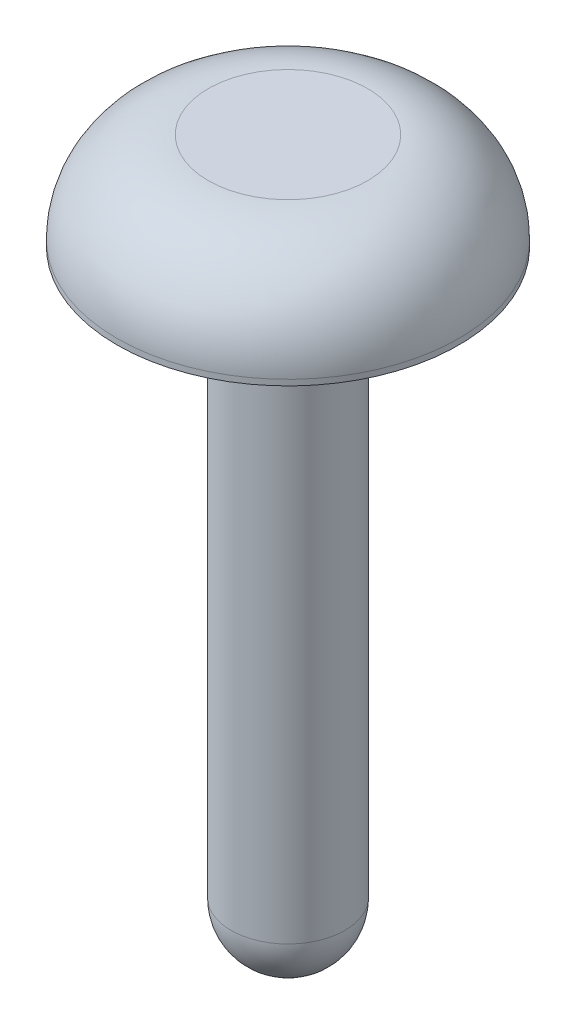
ISO-10303-21;
HEADER;
FILE_DESCRIPTION(('STEP AP214'),'2;1');
FILE_NAME('part.step','',(''),(''),'','','');
FILE_SCHEMA(('AUTOMOTIVE_DESIGN { 1 0 10303 214 1 1 1 1 }'));
ENDSEC;
DATA;
#1=APPLICATION_CONTEXT('core data for automotive mechanical design processes');
#2=APPLICATION_PROTOCOL_DEFINITION('international standard','automotive_design',2000,#1);
#3=PRODUCT_CONTEXT('',#1,'mechanical');
#4=PRODUCT('Part','Part','',(#3));
#5=PRODUCT_RELATED_PRODUCT_CATEGORY('part','',(#4));
#6=PRODUCT_DEFINITION_FORMATION('','',#4);
#7=PRODUCT_DEFINITION_CONTEXT('part definition',#1,'design');
#8=PRODUCT_DEFINITION('design','',#6,#7);
#9=PRODUCT_DEFINITION_SHAPE('','',#8);
#10=(LENGTH_UNIT() NAMED_UNIT(*) SI_UNIT(.MILLI.,.METRE.));
#11=(NAMED_UNIT(*) PLANE_ANGLE_UNIT() SI_UNIT($,.RADIAN.));
#12=(NAMED_UNIT(*) SI_UNIT($,.STERADIAN.) SOLID_ANGLE_UNIT());
#13=UNCERTAINTY_MEASURE_WITH_UNIT(LENGTH_MEASURE(1.E-05),#10,'distance_accuracy_value','');
#14=(GEOMETRIC_REPRESENTATION_CONTEXT(3) GLOBAL_UNCERTAINTY_ASSIGNED_CONTEXT((#13)) GLOBAL_UNIT_ASSIGNED_CONTEXT((#10,
#11,#12)) REPRESENTATION_CONTEXT('',''));
#15=CARTESIAN_POINT('',(0.,0.,0.));
#16=DIRECTION('',(0.,0.,1.));
#17=DIRECTION('',(1.,0.,0.));
#18=AXIS2_PLACEMENT_3D('',#15,#16,#17);
#19=CARTESIAN_POINT('',(0.,10.9,0.));
#20=DIRECTION('',(0.,1.,0.));
#21=DIRECTION('',(0.,0.,1.));
#22=AXIS2_PLACEMENT_3D('',#19,#20,#21);
#23=PLANE('',#22);
#24=CARTESIAN_POINT('',(0.,10.9,0.));
#25=DIRECTION('',(0.,-1.,0.));
#26=DIRECTION('',(0.,0.,-1.));
#27=AXIS2_PLACEMENT_3D('',#24,#25,#26);
#28=CIRCLE('',#27,2.5);
#29=CARTESIAN_POINT('',(0.,10.9,-2.5));
#30=VERTEX_POINT('',#29);
#31=EDGE_CURVE('E56',#30,#30,#28,.T.);
#32=ORIENTED_EDGE('',*,*,#31,.F.);
#33=EDGE_LOOP('',(#32));
#34=FACE_BOUND('',#33,.T.);
#35=CARTESIAN_POINT('',(0.,10.9,0.));
#36=DIRECTION('',(0.,1.,0.));
#37=DIRECTION('',(0.,0.,1.));
#38=AXIS2_PLACEMENT_3D('',#35,#36,#37);
#39=CIRCLE('',#38,3.);
#40=CARTESIAN_POINT('',(0.,10.9,3.));
#41=VERTEX_POINT('',#40);
#42=EDGE_CURVE('E50',#41,#41,#39,.T.);
#43=ORIENTED_EDGE('',*,*,#42,.F.);
#44=EDGE_LOOP('',(#43));
#45=FACE_BOUND('',#44,.T.);
#46=ADVANCED_FACE('F35',(#34,#45),#23,.F.);
#47=CARTESIAN_POINT('',(0.,10.9,0.));
#48=DIRECTION('',(0.,1.,0.));
#49=DIRECTION('',(0.,0.,1.));
#50=AXIS2_PLACEMENT_3D('',#47,#48,#49);
#51=CYLINDRICAL_SURFACE('',#50,3.);
#52=CARTESIAN_POINT('',(0.,11.0001,0.));
#53=DIRECTION('',(0.,1.,0.));
#54=DIRECTION('',(0.,0.,1.));
#55=AXIS2_PLACEMENT_3D('',#52,#53,#54);
#56=CIRCLE('',#55,3.);
#57=CARTESIAN_POINT('',(0.,11.0001,3.));
#58=VERTEX_POINT('',#57);
#59=EDGE_CURVE('E10',#58,#58,#56,.F.);
#60=ORIENTED_EDGE('',*,*,#59,.T.);
#61=EDGE_LOOP('',(#60));
#62=FACE_BOUND('',#61,.T.);
#63=ORIENTED_EDGE('',*,*,#42,.T.);
#64=EDGE_LOOP('',(#63));
#65=FACE_BOUND('',#64,.T.);
#66=ADVANCED_FACE('F82',(#62,#65),#51,.T.);
#67=CARTESIAN_POINT('',(0.,12.6001,0.));
#68=DIRECTION('',(0.,1.,0.));
#69=DIRECTION('',(0.,0.,1.));
#70=AXIS2_PLACEMENT_3D('',#67,#68,#69);
#71=PLANE('',#70);
#72=CARTESIAN_POINT('',(0.,12.6001,0.));
#73=DIRECTION('',(0.,1.,0.));
#74=DIRECTION('',(0.,0.,1.));
#75=AXIS2_PLACEMENT_3D('',#72,#73,#74);
#76=CIRCLE('',#75,1.4);
#77=CARTESIAN_POINT('',(0.,12.6001,1.4));
#78=VERTEX_POINT('',#77);
#79=EDGE_CURVE('E42',#78,#78,#76,.T.);
#80=ORIENTED_EDGE('',*,*,#79,.T.);
#81=EDGE_LOOP('',(#80));
#82=FACE_BOUND('',#81,.T.);
#83=ADVANCED_FACE('F87',(#82),#71,.T.);
#84=CARTESIAN_POINT('',(0.,11.0001,0.));
#85=DIRECTION('',(0.,1.,0.));
#86=DIRECTION('',(0.,0.,1.));
#87=AXIS2_PLACEMENT_3D('',#84,#85,#86);
#88=DEGENERATE_TOROIDAL_SURFACE('',#87,1.4,1.6,.T.);
#89=ORIENTED_EDGE('',*,*,#59,.F.);
#90=EDGE_LOOP('',(#89));
#91=FACE_BOUND('',#90,.T.);
#92=ORIENTED_EDGE('',*,*,#79,.F.);
#93=EDGE_LOOP('',(#92));
#94=FACE_BOUND('',#93,.T.);
#95=ADVANCED_FACE('F37',(#91,#94),#88,.T.);
#96=CARTESIAN_POINT('',(0.,11.9,0.));
#97=DIRECTION('',(0.,-1.,0.));
#98=DIRECTION('',(0.,0.,-1.));
#99=AXIS2_PLACEMENT_3D('',#96,#97,#98);
#100=CYLINDRICAL_SURFACE('',#99,2.5);
#101=CARTESIAN_POINT('',(0.,11.9,0.));
#102=DIRECTION('',(0.,-1.,0.));
#103=DIRECTION('',(0.,0.,-1.));
#104=AXIS2_PLACEMENT_3D('',#101,#102,#103);
#105=CIRCLE('',#104,2.5);
#106=CARTESIAN_POINT('',(0.,11.9,-2.5));
#107=VERTEX_POINT('',#106);
#108=EDGE_CURVE('E55',#107,#107,#105,.T.);
#109=ORIENTED_EDGE('',*,*,#108,.F.);
#110=EDGE_LOOP('',(#109));
#111=FACE_BOUND('',#110,.T.);
#112=ORIENTED_EDGE('',*,*,#31,.T.);
#113=EDGE_LOOP('',(#112));
#114=FACE_BOUND('',#113,.T.);
#115=ADVANCED_FACE('F71',(#111,#114),#100,.F.);
#116=CARTESIAN_POINT('',(0.,11.9,0.));
#117=DIRECTION('',(0.,-1.,0.));
#118=DIRECTION('',(0.,0.,-1.));
#119=AXIS2_PLACEMENT_3D('',#116,#117,#118);
#120=PLANE('',#119);
#121=CARTESIAN_POINT('',(0.,11.9,0.));
#122=DIRECTION('',(0.,-1.,0.));
#123=DIRECTION('',(0.,0.,-1.));
#124=AXIS2_PLACEMENT_3D('',#121,#122,#123);
#125=CIRCLE('',#124,1.);
#126=CARTESIAN_POINT('',(0.,11.9,-1.));
#127=VERTEX_POINT('',#126);
#128=EDGE_CURVE('E59',#127,#127,#125,.T.);
#129=ORIENTED_EDGE('',*,*,#128,.F.);
#130=EDGE_LOOP('',(#129));
#131=FACE_BOUND('',#130,.T.);
#132=ORIENTED_EDGE('',*,*,#108,.T.);
#133=EDGE_LOOP('',(#132));
#134=FACE_BOUND('',#133,.T.);
#135=ADVANCED_FACE('F67',(#131,#134),#120,.T.);
#136=CARTESIAN_POINT('',(0.,1.,0.));
#137=DIRECTION('',(0.,0.,1.));
#138=DIRECTION('',(1.,0.,0.));
#139=AXIS2_PLACEMENT_3D('',#136,#137,#138);
#140=SPHERICAL_SURFACE('',#139,1.);
#141=CARTESIAN_POINT('',(0.,1.,0.));
#142=DIRECTION('',(0.,-1.,0.));
#143=DIRECTION('',(0.,0.,-1.));
#144=AXIS2_PLACEMENT_3D('',#141,#142,#143);
#145=SPHERICAL_SURFACE('',#144,1.);
#146=CARTESIAN_POINT('',(0.,1.,0.));
#147=DIRECTION('',(0.,-1.,0.));
#148=DIRECTION('',(0.,0.,-1.));
#149=AXIS2_PLACEMENT_3D('',#146,#147,#148);
#150=CIRCLE('',#149,1.);
#151=CARTESIAN_POINT('',(0.,1.,-1.));
#152=VERTEX_POINT('',#151);
#153=EDGE_CURVE('E46',#152,#152,#150,.F.);
#154=ORIENTED_EDGE('',*,*,#153,.F.);
#155=EDGE_LOOP('',(#154));
#156=FACE_BOUND('',#155,.T.);
#157=ADVANCED_FACE('F70',(#156),#145,.T.);
#158=CARTESIAN_POINT('',(0.,12.6,0.));
#159=DIRECTION('',(0.,-1.,0.));
#160=DIRECTION('',(0.,0.,-1.));
#161=AXIS2_PLACEMENT_3D('',#158,#159,#160);
#162=CYLINDRICAL_SURFACE('',#161,1.);
#163=ORIENTED_EDGE('',*,*,#153,.T.);
#164=EDGE_LOOP('',(#163));
#165=FACE_BOUND('',#164,.T.);
#166=ORIENTED_EDGE('',*,*,#128,.T.);
#167=EDGE_LOOP('',(#166));
#168=FACE_BOUND('',#167,.T.);
#169=ADVANCED_FACE('F65',(#165,#168),#162,.T.);
#170=CLOSED_SHELL('',(#46,#66,#83,#95,#115,#135,#157,#169));
#171=MANIFOLD_SOLID_BREP('B2',#170);
#172=ADVANCED_BREP_SHAPE_REPRESENTATION('',(#18,#171),#14);
#173=SHAPE_DEFINITION_REPRESENTATION(#9,#172);
ENDSEC;
END-ISO-10303-21;
